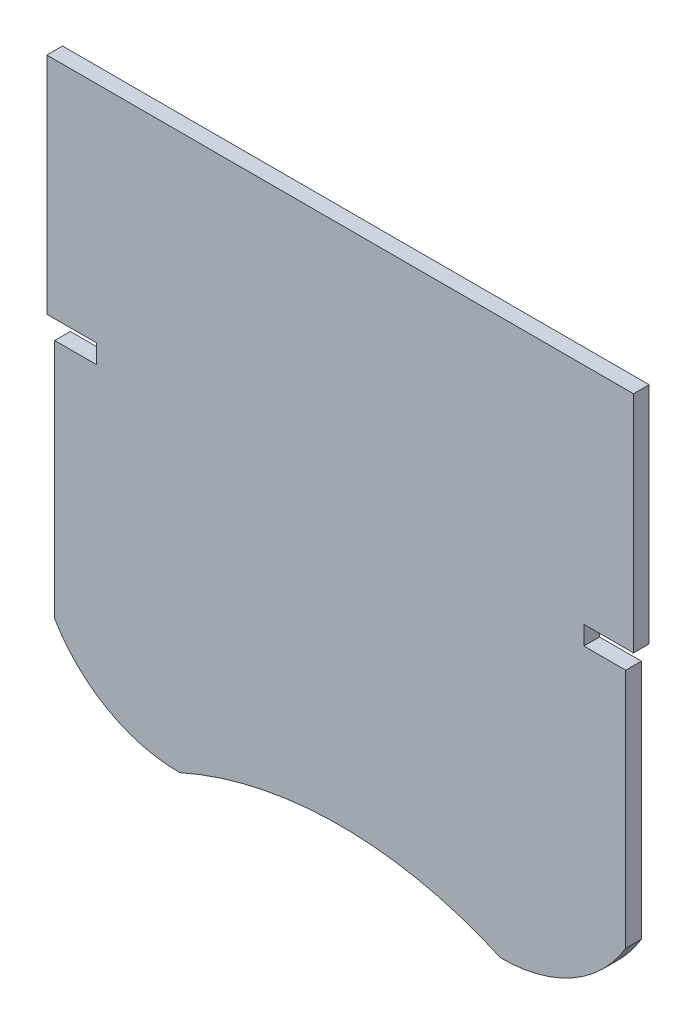
ISO-10303-21;
HEADER;
FILE_DESCRIPTION(('STEP AP214'),'2;1');
FILE_NAME('part.step','',(''),(''),'','','');
FILE_SCHEMA(('AUTOMOTIVE_DESIGN { 1 0 10303 214 1 1 1 1 }'));
ENDSEC;
DATA;
#1=APPLICATION_CONTEXT('core data for automotive mechanical design processes');
#2=APPLICATION_PROTOCOL_DEFINITION('international standard','automotive_design',2000,#1);
#3=PRODUCT_CONTEXT('',#1,'mechanical');
#4=PRODUCT('Part','Part','',(#3));
#5=PRODUCT_RELATED_PRODUCT_CATEGORY('part','',(#4));
#6=PRODUCT_DEFINITION_FORMATION('','',#4);
#7=PRODUCT_DEFINITION_CONTEXT('part definition',#1,'design');
#8=PRODUCT_DEFINITION('design','',#6,#7);
#9=PRODUCT_DEFINITION_SHAPE('','',#8);
#10=(LENGTH_UNIT() NAMED_UNIT(*) SI_UNIT(.MILLI.,.METRE.));
#11=(NAMED_UNIT(*) PLANE_ANGLE_UNIT() SI_UNIT($,.RADIAN.));
#12=(NAMED_UNIT(*) SI_UNIT($,.STERADIAN.) SOLID_ANGLE_UNIT());
#13=UNCERTAINTY_MEASURE_WITH_UNIT(LENGTH_MEASURE(1.E-05),#10,'distance_accuracy_value','');
#14=(GEOMETRIC_REPRESENTATION_CONTEXT(3) GLOBAL_UNCERTAINTY_ASSIGNED_CONTEXT((#13)) GLOBAL_UNIT_ASSIGNED_CONTEXT((#10,
#11,#12)) REPRESENTATION_CONTEXT('',''));
#15=CARTESIAN_POINT('',(0.,0.,0.));
#16=DIRECTION('',(0.,0.,1.));
#17=DIRECTION('',(1.,0.,0.));
#18=AXIS2_PLACEMENT_3D('',#15,#16,#17);
#19=CARTESIAN_POINT('',(37.5,0.,66.9));
#20=DIRECTION('',(-1.,0.,0.));
#21=DIRECTION('',(0.,-1.,0.));
#22=AXIS2_PLACEMENT_3D('',#19,#20,#21);
#23=PLANE('',#22);
#24=DIRECTION('',(0.,1.,0.));
#25=VECTOR('',#24,1.);
#26=CARTESIAN_POINT('',(37.5,0.,64.9));
#27=LINE('',#26,#25);
#28=CARTESIAN_POINT('',(37.5,-4.29999999999991,64.9));
#29=VERTEX_POINT('',#28);
#30=CARTESIAN_POINT('',(37.5,24.4,64.9));
#31=VERTEX_POINT('',#30);
#32=EDGE_CURVE('E222',#29,#31,#27,.T.);
#33=ORIENTED_EDGE('',*,*,#32,.T.);
#34=DIRECTION('',(0.,0.,1.));
#35=VECTOR('',#34,1.);
#36=CARTESIAN_POINT('',(37.5,24.4,64.9));
#37=LINE('',#36,#35);
#38=CARTESIAN_POINT('',(37.5,24.4,66.9));
#39=VERTEX_POINT('',#38);
#40=EDGE_CURVE('E225',#31,#39,#37,.T.);
#41=ORIENTED_EDGE('',*,*,#40,.T.);
#42=DIRECTION('',(0.,1.,0.));
#43=VECTOR('',#42,1.);
#44=CARTESIAN_POINT('',(37.5,0.,66.9));
#45=LINE('',#44,#43);
#46=CARTESIAN_POINT('',(37.5,-4.29999999999991,66.9));
#47=VERTEX_POINT('',#46);
#48=EDGE_CURVE('E304',#47,#39,#45,.T.);
#49=ORIENTED_EDGE('',*,*,#48,.F.);
#50=DIRECTION('',(0.,0.,1.));
#51=VECTOR('',#50,1.);
#52=CARTESIAN_POINT('',(37.5,-4.29999999999991,64.9));
#53=LINE('',#52,#51);
#54=EDGE_CURVE('E227',#29,#47,#53,.T.);
#55=ORIENTED_EDGE('',*,*,#54,.F.);
#56=EDGE_LOOP('',(#33,#41,#49,#55));
#57=FACE_BOUND('',#56,.T.);
#58=ADVANCED_FACE('F108',(#57),#23,.F.);
#59=CARTESIAN_POINT('',(0.,0.,66.9));
#60=DIRECTION('',(0.,0.,1.));
#61=DIRECTION('',(1.,0.,0.));
#62=AXIS2_PLACEMENT_3D('',#59,#60,#61);
#63=PLANE('',#62);
#64=DIRECTION('',(1.,0.,0.));
#65=VECTOR('',#64,1.);
#66=CARTESIAN_POINT('',(0.,-6.69999999999997,66.9));
#67=LINE('',#66,#65);
#68=CARTESIAN_POINT('',(-36.5,-6.69999999999997,66.9));
#69=VERTEX_POINT('',#68);
#70=CARTESIAN_POINT('',(-31.15,-6.69999999999997,66.9));
#71=VERTEX_POINT('',#70);
#72=EDGE_CURVE('E259',#69,#71,#67,.T.);
#73=ORIENTED_EDGE('',*,*,#72,.F.);
#74=DIRECTION('',(0.,1.,0.));
#75=VECTOR('',#74,1.);
#76=CARTESIAN_POINT('',(-36.5,0.,66.9));
#77=LINE('',#76,#75);
#78=CARTESIAN_POINT('',(-36.5,-37.5,66.9));
#79=VERTEX_POINT('',#78);
#80=EDGE_CURVE('E293',#79,#69,#77,.T.);
#81=ORIENTED_EDGE('',*,*,#80,.F.);
#82=CARTESIAN_POINT('',(-20.6469752103219,-28.1354039670829,66.9));
#83=DIRECTION('',(0.,0.,1.));
#84=DIRECTION('',(1.,0.,0.));
#85=AXIS2_PLACEMENT_3D('',#82,#83,#84);
#86=CIRCLE('',#85,18.4123342855237);
#87=CARTESIAN_POINT('',(-20.4999999999999,-46.5471516334351,66.9));
#88=VERTEX_POINT('',#87);
#89=EDGE_CURVE('E295',#88,#79,#86,.F.);
#90=ORIENTED_EDGE('',*,*,#89,.F.);
#91=CARTESIAN_POINT('',(0.,-92.1514277487294,66.9));
#92=DIRECTION('',(0.,0.,1.));
#93=DIRECTION('',(1.,0.,0.));
#94=AXIS2_PLACEMENT_3D('',#91,#92,#93);
#95=CIRCLE('',#94,50.);
#96=CARTESIAN_POINT('',(20.5000000000001,-46.5471516334351,66.9));
#97=VERTEX_POINT('',#96);
#98=EDGE_CURVE('E298',#97,#88,#95,.T.);
#99=ORIENTED_EDGE('',*,*,#98,.F.);
#100=CARTESIAN_POINT('',(20.6469752103219,-28.1354039670829,66.9));
#101=DIRECTION('',(0.,0.,1.));
#102=DIRECTION('',(1.,0.,0.));
#103=AXIS2_PLACEMENT_3D('',#100,#101,#102);
#104=CIRCLE('',#103,18.4123342855237);
#105=CARTESIAN_POINT('',(36.5,-37.5,66.9));
#106=VERTEX_POINT('',#105);
#107=EDGE_CURVE('E301',#106,#97,#104,.F.);
#108=ORIENTED_EDGE('',*,*,#107,.F.);
#109=DIRECTION('',(0.,-1.,0.));
#110=VECTOR('',#109,1.);
#111=CARTESIAN_POINT('',(36.5,0.,66.9));
#112=LINE('',#111,#110);
#113=CARTESIAN_POINT('',(36.5,-6.69999999999997,66.9));
#114=VERTEX_POINT('',#113);
#115=EDGE_CURVE('E125',#114,#106,#112,.T.);
#116=ORIENTED_EDGE('',*,*,#115,.F.);
#117=DIRECTION('',(-1.,0.,0.));
#118=VECTOR('',#117,1.);
#119=CARTESIAN_POINT('',(36.5,-6.69999999999997,66.9));
#120=LINE('',#119,#118);
#121=CARTESIAN_POINT('',(31.15,-6.69999999999997,66.9));
#122=VERTEX_POINT('',#121);
#123=EDGE_CURVE('E256',#114,#122,#120,.T.);
#124=ORIENTED_EDGE('',*,*,#123,.T.);
#125=DIRECTION('',(0.,-1.,0.));
#126=VECTOR('',#125,1.);
#127=CARTESIAN_POINT('',(31.15,0.,66.9));
#128=LINE('',#127,#126);
#129=CARTESIAN_POINT('',(31.15,-4.29999999999997,66.9));
#130=VERTEX_POINT('',#129);
#131=EDGE_CURVE('E265',#130,#122,#128,.T.);
#132=ORIENTED_EDGE('',*,*,#131,.F.);
#133=DIRECTION('',(1.,0.,0.));
#134=VECTOR('',#133,1.);
#135=CARTESIAN_POINT('',(0.,-4.29999999999998,66.9));
#136=LINE('',#135,#134);
#137=EDGE_CURVE('E281',#130,#47,#136,.T.);
#138=ORIENTED_EDGE('',*,*,#137,.T.);
#139=ORIENTED_EDGE('',*,*,#48,.T.);
#140=DIRECTION('',(-1.,0.,0.));
#141=VECTOR('',#140,1.);
#142=CARTESIAN_POINT('',(-37.5,24.4,66.9));
#143=LINE('',#142,#141);
#144=CARTESIAN_POINT('',(-37.5,24.4,66.9));
#145=VERTEX_POINT('',#144);
#146=EDGE_CURVE('E237',#39,#145,#143,.T.);
#147=ORIENTED_EDGE('',*,*,#146,.T.);
#148=DIRECTION('',(0.,-1.,0.));
#149=VECTOR('',#148,1.);
#150=CARTESIAN_POINT('',(-37.5,0.,66.9));
#151=LINE('',#150,#149);
#152=CARTESIAN_POINT('',(-37.5,-4.29999999999997,66.9));
#153=VERTEX_POINT('',#152);
#154=EDGE_CURVE('E229',#145,#153,#151,.T.);
#155=ORIENTED_EDGE('',*,*,#154,.T.);
#156=DIRECTION('',(-1.,0.,0.));
#157=VECTOR('',#156,1.);
#158=CARTESIAN_POINT('',(0.,-4.29999999999996,66.9));
#159=LINE('',#158,#157);
#160=CARTESIAN_POINT('',(-31.15,-4.29999999999997,66.9));
#161=VERTEX_POINT('',#160);
#162=EDGE_CURVE('E278',#161,#153,#159,.T.);
#163=ORIENTED_EDGE('',*,*,#162,.F.);
#164=DIRECTION('',(0.,-1.,0.));
#165=VECTOR('',#164,1.);
#166=CARTESIAN_POINT('',(-31.15,0.,66.9));
#167=LINE('',#166,#165);
#168=EDGE_CURVE('E252',#161,#71,#167,.T.);
#169=ORIENTED_EDGE('',*,*,#168,.T.);
#170=EDGE_LOOP('',(#73,#81,#90,#99,#108,#116,#124,#132,#138,#139,#147,#155,#163,#169));
#171=FACE_BOUND('',#170,.T.);
#172=ADVANCED_FACE('F336',(#171),#63,.T.);
#173=CARTESIAN_POINT('',(0.,0.,64.9));
#174=DIRECTION('',(0.,0.,1.));
#175=DIRECTION('',(1.,0.,0.));
#176=AXIS2_PLACEMENT_3D('',#173,#174,#175);
#177=PLANE('',#176);
#178=DIRECTION('',(0.,1.,0.));
#179=VECTOR('',#178,1.);
#180=CARTESIAN_POINT('',(-36.5,0.,64.9));
#181=LINE('',#180,#179);
#182=CARTESIAN_POINT('',(-36.5,-37.5,64.9));
#183=VERTEX_POINT('',#182);
#184=CARTESIAN_POINT('',(-36.5,-6.69999999999997,64.9));
#185=VERTEX_POINT('',#184);
#186=EDGE_CURVE('E308',#183,#185,#181,.T.);
#187=ORIENTED_EDGE('',*,*,#186,.T.);
#188=DIRECTION('',(1.,0.,0.));
#189=VECTOR('',#188,1.);
#190=CARTESIAN_POINT('',(0.,-6.69999999999997,64.9));
#191=LINE('',#190,#189);
#192=CARTESIAN_POINT('',(-31.15,-6.69999999999997,64.9));
#193=VERTEX_POINT('',#192);
#194=EDGE_CURVE('E275',#185,#193,#191,.T.);
#195=ORIENTED_EDGE('',*,*,#194,.T.);
#196=DIRECTION('',(0.,-1.,0.));
#197=VECTOR('',#196,1.);
#198=CARTESIAN_POINT('',(-31.15,0.,64.9));
#199=LINE('',#198,#197);
#200=CARTESIAN_POINT('',(-31.15,-4.29999999999997,64.9));
#201=VERTEX_POINT('',#200);
#202=EDGE_CURVE('E12',#201,#193,#199,.T.);
#203=ORIENTED_EDGE('',*,*,#202,.F.);
#204=DIRECTION('',(-1.,0.,0.));
#205=VECTOR('',#204,1.);
#206=CARTESIAN_POINT('',(0.,-4.29999999999996,64.9));
#207=LINE('',#206,#205);
#208=CARTESIAN_POINT('',(-37.5,-4.29999999999997,64.9));
#209=VERTEX_POINT('',#208);
#210=EDGE_CURVE('E286',#201,#209,#207,.T.);
#211=ORIENTED_EDGE('',*,*,#210,.T.);
#212=DIRECTION('',(0.,-1.,0.));
#213=VECTOR('',#212,1.);
#214=CARTESIAN_POINT('',(-37.5,0.,64.9));
#215=LINE('',#214,#213);
#216=CARTESIAN_POINT('',(-37.5,24.4,64.9));
#217=VERTEX_POINT('',#216);
#218=EDGE_CURVE('E243',#217,#209,#215,.T.);
#219=ORIENTED_EDGE('',*,*,#218,.F.);
#220=DIRECTION('',(-1.,0.,0.));
#221=VECTOR('',#220,1.);
#222=CARTESIAN_POINT('',(-37.5,24.4,64.9));
#223=LINE('',#222,#221);
#224=EDGE_CURVE('E235',#31,#217,#223,.T.);
#225=ORIENTED_EDGE('',*,*,#224,.F.);
#226=ORIENTED_EDGE('',*,*,#32,.F.);
#227=DIRECTION('',(1.,0.,0.));
#228=VECTOR('',#227,1.);
#229=CARTESIAN_POINT('',(0.,-4.29999999999998,64.9));
#230=LINE('',#229,#228);
#231=CARTESIAN_POINT('',(31.15,-4.29999999999997,64.9));
#232=VERTEX_POINT('',#231);
#233=EDGE_CURVE('E279',#232,#29,#230,.T.);
#234=ORIENTED_EDGE('',*,*,#233,.F.);
#235=DIRECTION('',(0.,-1.,0.));
#236=VECTOR('',#235,1.);
#237=CARTESIAN_POINT('',(31.15,0.,64.9));
#238=LINE('',#237,#236);
#239=CARTESIAN_POINT('',(31.15,-6.69999999999997,64.9));
#240=VERTEX_POINT('',#239);
#241=EDGE_CURVE('E117',#232,#240,#238,.T.);
#242=ORIENTED_EDGE('',*,*,#241,.T.);
#243=DIRECTION('',(1.,0.,0.));
#244=VECTOR('',#243,1.);
#245=CARTESIAN_POINT('',(0.,-6.69999999999997,64.9));
#246=LINE('',#245,#244);
#247=CARTESIAN_POINT('',(36.5,-6.69999999999997,64.9));
#248=VERTEX_POINT('',#247);
#249=EDGE_CURVE('E262',#240,#248,#246,.T.);
#250=ORIENTED_EDGE('',*,*,#249,.T.);
#251=DIRECTION('',(0.,-1.,0.));
#252=VECTOR('',#251,1.);
#253=CARTESIAN_POINT('',(36.5,0.,64.9));
#254=LINE('',#253,#252);
#255=CARTESIAN_POINT('',(36.5,-37.5,64.9));
#256=VERTEX_POINT('',#255);
#257=EDGE_CURVE('E151',#248,#256,#254,.T.);
#258=ORIENTED_EDGE('',*,*,#257,.T.);
#259=CARTESIAN_POINT('',(20.6469752103219,-28.1354039670829,64.9));
#260=DIRECTION('',(0.,0.,1.));
#261=DIRECTION('',(1.,0.,0.));
#262=AXIS2_PLACEMENT_3D('',#259,#260,#261);
#263=CIRCLE('',#262,18.4123342855237);
#264=CARTESIAN_POINT('',(20.5000000000001,-46.5471516334351,64.9));
#265=VERTEX_POINT('',#264);
#266=EDGE_CURVE('E316',#256,#265,#263,.F.);
#267=ORIENTED_EDGE('',*,*,#266,.T.);
#268=CARTESIAN_POINT('',(0.,-92.1514277487294,64.9));
#269=DIRECTION('',(0.,0.,1.));
#270=DIRECTION('',(1.,0.,0.));
#271=AXIS2_PLACEMENT_3D('',#268,#269,#270);
#272=CIRCLE('',#271,50.);
#273=CARTESIAN_POINT('',(-20.4999999999999,-46.5471516334351,64.9));
#274=VERTEX_POINT('',#273);
#275=EDGE_CURVE('E313',#265,#274,#272,.T.);
#276=ORIENTED_EDGE('',*,*,#275,.T.);
#277=CARTESIAN_POINT('',(-20.6469752103219,-28.1354039670829,64.9));
#278=DIRECTION('',(0.,0.,1.));
#279=DIRECTION('',(1.,0.,0.));
#280=AXIS2_PLACEMENT_3D('',#277,#278,#279);
#281=CIRCLE('',#280,18.4123342855237);
#282=EDGE_CURVE('E310',#274,#183,#281,.F.);
#283=ORIENTED_EDGE('',*,*,#282,.T.);
#284=EDGE_LOOP('',(#187,#195,#203,#211,#219,#225,#226,#234,#242,#250,#258,#267,#276,#283));
#285=FACE_BOUND('',#284,.T.);
#286=ADVANCED_FACE('F241',(#285),#177,.F.);
#287=CARTESIAN_POINT('',(-37.5,0.,66.9));
#288=DIRECTION('',(1.,0.,0.));
#289=DIRECTION('',(0.,1.,0.));
#290=AXIS2_PLACEMENT_3D('',#287,#288,#289);
#291=PLANE('',#290);
#292=ORIENTED_EDGE('',*,*,#154,.F.);
#293=DIRECTION('',(0.,0.,1.));
#294=VECTOR('',#293,1.);
#295=CARTESIAN_POINT('',(-37.5,24.4,64.9));
#296=LINE('',#295,#294);
#297=EDGE_CURVE('E238',#217,#145,#296,.T.);
#298=ORIENTED_EDGE('',*,*,#297,.F.);
#299=ORIENTED_EDGE('',*,*,#218,.T.);
#300=DIRECTION('',(0.,0.,1.));
#301=VECTOR('',#300,1.);
#302=CARTESIAN_POINT('',(-37.5,-4.29999999999997,64.9));
#303=LINE('',#302,#301);
#304=EDGE_CURVE('E284',#209,#153,#303,.T.);
#305=ORIENTED_EDGE('',*,*,#304,.T.);
#306=EDGE_LOOP('',(#292,#298,#299,#305));
#307=FACE_BOUND('',#306,.T.);
#308=ADVANCED_FACE('F110',(#307),#291,.F.);
#309=CARTESIAN_POINT('',(-36.5,0.,66.9));
#310=DIRECTION('',(-1.,0.,0.));
#311=DIRECTION('',(0.,-1.,0.));
#312=AXIS2_PLACEMENT_3D('',#309,#310,#311);
#313=PLANE('',#312);
#314=DIRECTION('',(0.,0.,1.));
#315=VECTOR('',#314,1.);
#316=CARTESIAN_POINT('',(-36.5,-6.69999999999997,66.9));
#317=LINE('',#316,#315);
#318=EDGE_CURVE('E324',#185,#69,#317,.T.);
#319=ORIENTED_EDGE('',*,*,#318,.F.);
#320=ORIENTED_EDGE('',*,*,#186,.F.);
#321=DIRECTION('',(0.,0.,-1.));
#322=VECTOR('',#321,1.);
#323=CARTESIAN_POINT('',(-36.5,-37.5,66.9));
#324=LINE('',#323,#322);
#325=EDGE_CURVE('E157',#79,#183,#324,.T.);
#326=ORIENTED_EDGE('',*,*,#325,.F.);
#327=ORIENTED_EDGE('',*,*,#80,.T.);
#328=EDGE_LOOP('',(#319,#320,#326,#327));
#329=FACE_BOUND('',#328,.T.);
#330=ADVANCED_FACE('F350',(#329),#313,.T.);
#331=CARTESIAN_POINT('',(-20.6469752103219,-28.1354039670829,66.9));
#332=DIRECTION('',(0.,0.,-1.));
#333=DIRECTION('',(-1.,0.,0.));
#334=AXIS2_PLACEMENT_3D('',#331,#332,#333);
#335=CYLINDRICAL_SURFACE('',#334,18.4123342855237);
#336=ORIENTED_EDGE('',*,*,#282,.F.);
#337=DIRECTION('',(0.,0.,-1.));
#338=VECTOR('',#337,1.);
#339=CARTESIAN_POINT('',(-20.4999999999999,-46.5471516334351,66.9));
#340=LINE('',#339,#338);
#341=EDGE_CURVE('E321',#88,#274,#340,.T.);
#342=ORIENTED_EDGE('',*,*,#341,.F.);
#343=ORIENTED_EDGE('',*,*,#89,.T.);
#344=ORIENTED_EDGE('',*,*,#325,.T.);
#345=EDGE_LOOP('',(#336,#342,#343,#344));
#346=FACE_BOUND('',#345,.T.);
#347=ADVANCED_FACE('F348',(#346),#335,.T.);
#348=CARTESIAN_POINT('',(0.,-92.1514277487294,66.9));
#349=DIRECTION('',(0.,0.,-1.));
#350=DIRECTION('',(-1.,0.,0.));
#351=AXIS2_PLACEMENT_3D('',#348,#349,#350);
#352=CYLINDRICAL_SURFACE('',#351,50.);
#353=ORIENTED_EDGE('',*,*,#275,.F.);
#354=DIRECTION('',(0.,0.,-1.));
#355=VECTOR('',#354,1.);
#356=CARTESIAN_POINT('',(20.5000000000001,-46.5471516334351,66.9));
#357=LINE('',#356,#355);
#358=EDGE_CURVE('E143',#97,#265,#357,.T.);
#359=ORIENTED_EDGE('',*,*,#358,.F.);
#360=ORIENTED_EDGE('',*,*,#98,.T.);
#361=ORIENTED_EDGE('',*,*,#341,.T.);
#362=EDGE_LOOP('',(#353,#359,#360,#361));
#363=FACE_BOUND('',#362,.T.);
#364=ADVANCED_FACE('F344',(#363),#352,.F.);
#365=CARTESIAN_POINT('',(20.6469752103219,-28.1354039670829,66.9));
#366=DIRECTION('',(0.,0.,-1.));
#367=DIRECTION('',(-1.,0.,0.));
#368=AXIS2_PLACEMENT_3D('',#365,#366,#367);
#369=CYLINDRICAL_SURFACE('',#368,18.4123342855237);
#370=ORIENTED_EDGE('',*,*,#266,.F.);
#371=DIRECTION('',(0.,0.,-1.));
#372=VECTOR('',#371,1.);
#373=CARTESIAN_POINT('',(36.5,-37.5,66.9));
#374=LINE('',#373,#372);
#375=EDGE_CURVE('E306',#106,#256,#374,.T.);
#376=ORIENTED_EDGE('',*,*,#375,.F.);
#377=ORIENTED_EDGE('',*,*,#107,.T.);
#378=ORIENTED_EDGE('',*,*,#358,.T.);
#379=EDGE_LOOP('',(#370,#376,#377,#378));
#380=FACE_BOUND('',#379,.T.);
#381=ADVANCED_FACE('F341',(#380),#369,.T.);
#382=CARTESIAN_POINT('',(36.5,0.,66.9));
#383=DIRECTION('',(1.,0.,0.));
#384=DIRECTION('',(0.,1.,0.));
#385=AXIS2_PLACEMENT_3D('',#382,#383,#384);
#386=PLANE('',#385);
#387=DIRECTION('',(0.,0.,1.));
#388=VECTOR('',#387,1.);
#389=CARTESIAN_POINT('',(36.5,-6.69999999999997,56.9));
#390=LINE('',#389,#388);
#391=EDGE_CURVE('E263',#248,#114,#390,.T.);
#392=ORIENTED_EDGE('',*,*,#391,.T.);
#393=ORIENTED_EDGE('',*,*,#115,.T.);
#394=ORIENTED_EDGE('',*,*,#375,.T.);
#395=ORIENTED_EDGE('',*,*,#257,.F.);
#396=EDGE_LOOP('',(#392,#393,#394,#395));
#397=FACE_BOUND('',#396,.T.);
#398=ADVANCED_FACE('F340',(#397),#386,.T.);
#399=CARTESIAN_POINT('',(0.,-4.29999999999996,64.9));
#400=DIRECTION('',(0.,1.,0.));
#401=DIRECTION('',(-1.,0.,0.));
#402=AXIS2_PLACEMENT_3D('',#399,#400,#401);
#403=PLANE('',#402);
#404=ORIENTED_EDGE('',*,*,#162,.T.);
#405=ORIENTED_EDGE('',*,*,#304,.F.);
#406=ORIENTED_EDGE('',*,*,#210,.F.);
#407=DIRECTION('',(0.,0.,1.));
#408=VECTOR('',#407,1.);
#409=CARTESIAN_POINT('',(-31.15,-4.29999999999997,56.9));
#410=LINE('',#409,#408);
#411=EDGE_CURVE('E253',#201,#161,#410,.T.);
#412=ORIENTED_EDGE('',*,*,#411,.T.);
#413=EDGE_LOOP('',(#404,#405,#406,#412));
#414=FACE_BOUND('',#413,.T.);
#415=ADVANCED_FACE('F360',(#414),#403,.F.);
#416=CARTESIAN_POINT('',(0.,-4.29999999999998,64.9));
#417=DIRECTION('',(0.,-1.,0.));
#418=DIRECTION('',(1.,0.,0.));
#419=AXIS2_PLACEMENT_3D('',#416,#417,#418);
#420=PLANE('',#419);
#421=ORIENTED_EDGE('',*,*,#137,.F.);
#422=DIRECTION('',(0.,0.,1.));
#423=VECTOR('',#422,1.);
#424=CARTESIAN_POINT('',(31.15,-4.29999999999997,56.9));
#425=LINE('',#424,#423);
#426=EDGE_CURVE('E248',#232,#130,#425,.T.);
#427=ORIENTED_EDGE('',*,*,#426,.F.);
#428=ORIENTED_EDGE('',*,*,#233,.T.);
#429=ORIENTED_EDGE('',*,*,#54,.T.);
#430=EDGE_LOOP('',(#421,#427,#428,#429));
#431=FACE_BOUND('',#430,.T.);
#432=ADVANCED_FACE('F333',(#431),#420,.T.);
#433=CARTESIAN_POINT('',(31.15,0.,56.9));
#434=DIRECTION('',(-1.,0.,0.));
#435=DIRECTION('',(0.,0.,1.));
#436=AXIS2_PLACEMENT_3D('',#433,#434,#435);
#437=PLANE('',#436);
#438=ORIENTED_EDGE('',*,*,#426,.T.);
#439=ORIENTED_EDGE('',*,*,#131,.T.);
#440=DIRECTION('',(0.,0.,1.));
#441=VECTOR('',#440,1.);
#442=CARTESIAN_POINT('',(31.15,-6.69999999999997,56.9));
#443=LINE('',#442,#441);
#444=EDGE_CURVE('E268',#240,#122,#443,.T.);
#445=ORIENTED_EDGE('',*,*,#444,.F.);
#446=ORIENTED_EDGE('',*,*,#241,.F.);
#447=EDGE_LOOP('',(#438,#439,#445,#446));
#448=FACE_BOUND('',#447,.T.);
#449=ADVANCED_FACE('F330',(#448),#437,.F.);
#450=CARTESIAN_POINT('',(0.,-6.69999999999997,56.9));
#451=DIRECTION('',(0.,-1.,0.));
#452=DIRECTION('',(0.,0.,-1.));
#453=AXIS2_PLACEMENT_3D('',#450,#451,#452);
#454=PLANE('',#453);
#455=ORIENTED_EDGE('',*,*,#444,.T.);
#456=ORIENTED_EDGE('',*,*,#123,.F.);
#457=ORIENTED_EDGE('',*,*,#391,.F.);
#458=ORIENTED_EDGE('',*,*,#249,.F.);
#459=EDGE_LOOP('',(#455,#456,#457,#458));
#460=FACE_BOUND('',#459,.T.);
#461=ADVANCED_FACE('F339',(#460),#454,.F.);
#462=CARTESIAN_POINT('',(-31.15,0.,56.9));
#463=DIRECTION('',(-1.,0.,0.));
#464=DIRECTION('',(0.,0.,1.));
#465=AXIS2_PLACEMENT_3D('',#462,#463,#464);
#466=PLANE('',#465);
#467=ORIENTED_EDGE('',*,*,#202,.T.);
#468=DIRECTION('',(0.,0.,1.));
#469=VECTOR('',#468,1.);
#470=CARTESIAN_POINT('',(-31.15,-6.69999999999997,56.9));
#471=LINE('',#470,#469);
#472=EDGE_CURVE('E250',#193,#71,#471,.T.);
#473=ORIENTED_EDGE('',*,*,#472,.T.);
#474=ORIENTED_EDGE('',*,*,#168,.F.);
#475=ORIENTED_EDGE('',*,*,#411,.F.);
#476=EDGE_LOOP('',(#467,#473,#474,#475));
#477=FACE_BOUND('',#476,.T.);
#478=ADVANCED_FACE('F357',(#477),#466,.T.);
#479=CARTESIAN_POINT('',(0.,-6.69999999999997,56.9));
#480=DIRECTION('',(0.,-1.,0.));
#481=DIRECTION('',(0.,0.,-1.));
#482=AXIS2_PLACEMENT_3D('',#479,#480,#481);
#483=PLANE('',#482);
#484=ORIENTED_EDGE('',*,*,#318,.T.);
#485=ORIENTED_EDGE('',*,*,#72,.T.);
#486=ORIENTED_EDGE('',*,*,#472,.F.);
#487=ORIENTED_EDGE('',*,*,#194,.F.);
#488=EDGE_LOOP('',(#484,#485,#486,#487));
#489=FACE_BOUND('',#488,.T.);
#490=ADVANCED_FACE('F354',(#489),#483,.F.);
#491=CARTESIAN_POINT('',(-37.5,24.4,64.9));
#492=DIRECTION('',(0.,1.,0.));
#493=DIRECTION('',(0.,0.,1.));
#494=AXIS2_PLACEMENT_3D('',#491,#492,#493);
#495=PLANE('',#494);
#496=ORIENTED_EDGE('',*,*,#146,.F.);
#497=ORIENTED_EDGE('',*,*,#40,.F.);
#498=ORIENTED_EDGE('',*,*,#224,.T.);
#499=ORIENTED_EDGE('',*,*,#297,.T.);
#500=EDGE_LOOP('',(#496,#497,#498,#499));
#501=FACE_BOUND('',#500,.T.);
#502=ADVANCED_FACE('F233',(#501),#495,.T.);
#503=CLOSED_SHELL('',(#58,#172,#286,#308,#330,#347,#364,#381,#398,#415,#432,#449,#461,#478,#490,#502));
#504=MANIFOLD_SOLID_BREP('B2',#503);
#505=ADVANCED_BREP_SHAPE_REPRESENTATION('',(#18,#504),#14);
#506=SHAPE_DEFINITION_REPRESENTATION(#9,#505);
ENDSEC;
END-ISO-10303-21;
